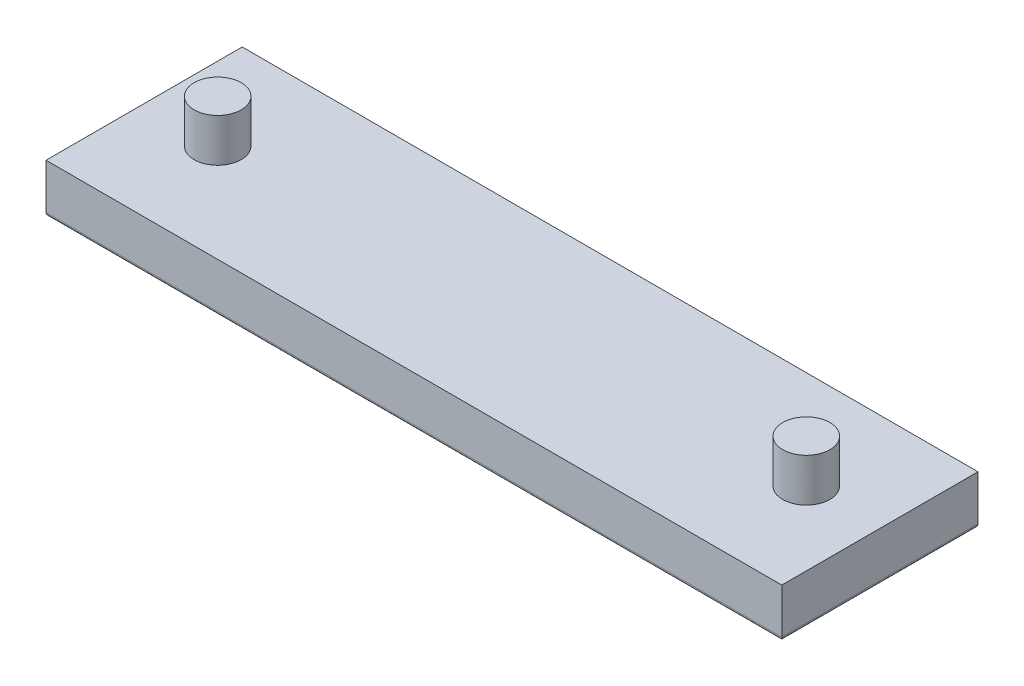
ISO-10303-21;
HEADER;
FILE_DESCRIPTION(('STEP AP214'),'2;1');
FILE_NAME('part.step','',(''),(''),'','','');
FILE_SCHEMA(('AUTOMOTIVE_DESIGN { 1 0 10303 214 1 1 1 1 }'));
ENDSEC;
DATA;
#1=APPLICATION_CONTEXT('core data for automotive mechanical design processes');
#2=APPLICATION_PROTOCOL_DEFINITION('international standard','automotive_design',2000,#1);
#3=PRODUCT_CONTEXT('',#1,'mechanical');
#4=PRODUCT('Part','Part','',(#3));
#5=PRODUCT_RELATED_PRODUCT_CATEGORY('part','',(#4));
#6=PRODUCT_DEFINITION_FORMATION('','',#4);
#7=PRODUCT_DEFINITION_CONTEXT('part definition',#1,'design');
#8=PRODUCT_DEFINITION('design','',#6,#7);
#9=PRODUCT_DEFINITION_SHAPE('','',#8);
#10=(LENGTH_UNIT() NAMED_UNIT(*) SI_UNIT(.MILLI.,.METRE.));
#11=(NAMED_UNIT(*) PLANE_ANGLE_UNIT() SI_UNIT($,.RADIAN.));
#12=(NAMED_UNIT(*) SI_UNIT($,.STERADIAN.) SOLID_ANGLE_UNIT());
#13=UNCERTAINTY_MEASURE_WITH_UNIT(LENGTH_MEASURE(1.E-05),#10,'distance_accuracy_value','');
#14=(GEOMETRIC_REPRESENTATION_CONTEXT(3) GLOBAL_UNCERTAINTY_ASSIGNED_CONTEXT((#13)) GLOBAL_UNIT_ASSIGNED_CONTEXT((#10,
#11,#12)) REPRESENTATION_CONTEXT('',''));
#15=CARTESIAN_POINT('',(0.,0.,0.));
#16=DIRECTION('',(0.,0.,1.));
#17=DIRECTION('',(1.,0.,0.));
#18=AXIS2_PLACEMENT_3D('',#15,#16,#17);
#19=CARTESIAN_POINT('',(47.625,6.35,12.7));
#20=DIRECTION('',(-1.,0.,0.));
#21=DIRECTION('',(0.,0.,1.));
#22=AXIS2_PLACEMENT_3D('',#19,#20,#21);
#23=PLANE('',#22);
#24=DIRECTION('',(0.,-1.,0.));
#25=VECTOR('',#24,1.);
#26=CARTESIAN_POINT('',(47.625,6.35,12.7));
#27=LINE('',#26,#25);
#28=CARTESIAN_POINT('',(47.625,6.35,12.7));
#29=VERTEX_POINT('',#28);
#30=CARTESIAN_POINT('',(47.625,0.508,12.7));
#31=VERTEX_POINT('',#30);
#32=EDGE_CURVE('E184',#29,#31,#27,.T.);
#33=ORIENTED_EDGE('',*,*,#32,.T.);
#34=DIRECTION('',(0.,0.,-1.));
#35=VECTOR('',#34,1.);
#36=CARTESIAN_POINT('',(47.625,0.508,-12.7));
#37=LINE('',#36,#35);
#38=CARTESIAN_POINT('',(47.625,0.508,-12.7));
#39=VERTEX_POINT('',#38);
#40=EDGE_CURVE('E11',#31,#39,#37,.T.);
#41=ORIENTED_EDGE('',*,*,#40,.T.);
#42=DIRECTION('',(0.,-1.,0.));
#43=VECTOR('',#42,1.);
#44=CARTESIAN_POINT('',(47.625,6.35,-12.7));
#45=LINE('',#44,#43);
#46=CARTESIAN_POINT('',(47.625,6.35,-12.7));
#47=VERTEX_POINT('',#46);
#48=EDGE_CURVE('E101',#47,#39,#45,.T.);
#49=ORIENTED_EDGE('',*,*,#48,.F.);
#50=DIRECTION('',(0.,0.,-1.));
#51=VECTOR('',#50,1.);
#52=CARTESIAN_POINT('',(47.625,6.35,12.7));
#53=LINE('',#52,#51);
#54=EDGE_CURVE('E108',#29,#47,#53,.T.);
#55=ORIENTED_EDGE('',*,*,#54,.F.);
#56=EDGE_LOOP('',(#33,#41,#49,#55));
#57=FACE_BOUND('',#56,.T.);
#58=ADVANCED_FACE('F39',(#57),#23,.F.);
#59=CARTESIAN_POINT('',(-47.625,6.35,-12.7));
#60=DIRECTION('',(0.,0.,1.));
#61=DIRECTION('',(1.,0.,0.));
#62=AXIS2_PLACEMENT_3D('',#59,#60,#61);
#63=PLANE('',#62);
#64=ORIENTED_EDGE('',*,*,#48,.T.);
#65=DIRECTION('',(-1.,0.,0.));
#66=VECTOR('',#65,1.);
#67=CARTESIAN_POINT('',(-47.625,0.508,-12.7));
#68=LINE('',#67,#66);
#69=CARTESIAN_POINT('',(-47.625,0.508,-12.7));
#70=VERTEX_POINT('',#69);
#71=EDGE_CURVE('E134',#39,#70,#68,.T.);
#72=ORIENTED_EDGE('',*,*,#71,.T.);
#73=DIRECTION('',(0.,-1.,0.));
#74=VECTOR('',#73,1.);
#75=CARTESIAN_POINT('',(-47.625,6.35,-12.7));
#76=LINE('',#75,#74);
#77=CARTESIAN_POINT('',(-47.625,6.35,-12.7));
#78=VERTEX_POINT('',#77);
#79=EDGE_CURVE('E103',#78,#70,#76,.T.);
#80=ORIENTED_EDGE('',*,*,#79,.F.);
#81=DIRECTION('',(-1.,0.,0.));
#82=VECTOR('',#81,1.);
#83=CARTESIAN_POINT('',(-47.625,6.35,-12.7));
#84=LINE('',#83,#82);
#85=EDGE_CURVE('E96',#47,#78,#84,.T.);
#86=ORIENTED_EDGE('',*,*,#85,.F.);
#87=EDGE_LOOP('',(#64,#72,#80,#86));
#88=FACE_BOUND('',#87,.T.);
#89=ADVANCED_FACE('F98',(#88),#63,.F.);
#90=CARTESIAN_POINT('',(-47.625,6.35,12.7));
#91=DIRECTION('',(1.,0.,0.));
#92=DIRECTION('',(0.,0.,-1.));
#93=AXIS2_PLACEMENT_3D('',#90,#91,#92);
#94=PLANE('',#93);
#95=ORIENTED_EDGE('',*,*,#79,.T.);
#96=DIRECTION('',(0.,0.,1.));
#97=VECTOR('',#96,1.);
#98=CARTESIAN_POINT('',(-47.625,0.508,12.7));
#99=LINE('',#98,#97);
#100=CARTESIAN_POINT('',(-47.625,0.508,12.7));
#101=VERTEX_POINT('',#100);
#102=EDGE_CURVE('E64',#70,#101,#99,.T.);
#103=ORIENTED_EDGE('',*,*,#102,.T.);
#104=DIRECTION('',(0.,-1.,0.));
#105=VECTOR('',#104,1.);
#106=CARTESIAN_POINT('',(-47.625,6.35,12.7));
#107=LINE('',#106,#105);
#108=CARTESIAN_POINT('',(-47.625,6.35,12.7));
#109=VERTEX_POINT('',#108);
#110=EDGE_CURVE('E127',#109,#101,#107,.T.);
#111=ORIENTED_EDGE('',*,*,#110,.F.);
#112=DIRECTION('',(0.,0.,1.));
#113=VECTOR('',#112,1.);
#114=CARTESIAN_POINT('',(-47.625,6.35,12.7));
#115=LINE('',#114,#113);
#116=EDGE_CURVE('E107',#78,#109,#115,.T.);
#117=ORIENTED_EDGE('',*,*,#116,.F.);
#118=EDGE_LOOP('',(#95,#103,#111,#117));
#119=FACE_BOUND('',#118,.T.);
#120=ADVANCED_FACE('F196',(#119),#94,.F.);
#121=CARTESIAN_POINT('',(-47.625,6.35,12.7));
#122=DIRECTION('',(0.,0.,-1.));
#123=DIRECTION('',(-1.,0.,0.));
#124=AXIS2_PLACEMENT_3D('',#121,#122,#123);
#125=PLANE('',#124);
#126=ORIENTED_EDGE('',*,*,#110,.T.);
#127=DIRECTION('',(1.,0.,0.));
#128=VECTOR('',#127,1.);
#129=CARTESIAN_POINT('',(47.625,0.508,12.7));
#130=LINE('',#129,#128);
#131=EDGE_CURVE('E49',#101,#31,#130,.T.);
#132=ORIENTED_EDGE('',*,*,#131,.T.);
#133=ORIENTED_EDGE('',*,*,#32,.F.);
#134=DIRECTION('',(1.,0.,0.));
#135=VECTOR('',#134,1.);
#136=CARTESIAN_POINT('',(-47.625,6.35,12.7));
#137=LINE('',#136,#135);
#138=EDGE_CURVE('E113',#109,#29,#137,.T.);
#139=ORIENTED_EDGE('',*,*,#138,.F.);
#140=EDGE_LOOP('',(#126,#132,#133,#139));
#141=FACE_BOUND('',#140,.T.);
#142=ADVANCED_FACE('F187',(#141),#125,.F.);
#143=CARTESIAN_POINT('',(0.,6.35,0.));
#144=DIRECTION('',(0.,-1.,0.));
#145=DIRECTION('',(0.,0.,-1.));
#146=AXIS2_PLACEMENT_3D('',#143,#144,#145);
#147=PLANE('',#146);
#148=CARTESIAN_POINT('',(-38.1,6.35,0.));
#149=DIRECTION('',(0.,-1.,0.));
#150=DIRECTION('',(0.,0.,-1.));
#151=AXIS2_PLACEMENT_3D('',#148,#149,#150);
#152=CIRCLE('',#151,3.048);
#153=CARTESIAN_POINT('',(-38.1,6.35,-3.04799999999999));
#154=VERTEX_POINT('',#153);
#155=EDGE_CURVE('E125',#154,#154,#152,.F.);
#156=ORIENTED_EDGE('',*,*,#155,.F.);
#157=EDGE_LOOP('',(#156));
#158=FACE_BOUND('',#157,.T.);
#159=CARTESIAN_POINT('',(38.1,6.35,0.));
#160=DIRECTION('',(0.,-1.,0.));
#161=DIRECTION('',(0.,0.,-1.));
#162=AXIS2_PLACEMENT_3D('',#159,#160,#161);
#163=CIRCLE('',#162,3.048);
#164=CARTESIAN_POINT('',(38.1,6.35,-3.048));
#165=VERTEX_POINT('',#164);
#166=EDGE_CURVE('E120',#165,#165,#163,.F.);
#167=ORIENTED_EDGE('',*,*,#166,.F.);
#168=EDGE_LOOP('',(#167));
#169=FACE_BOUND('',#168,.T.);
#170=ORIENTED_EDGE('',*,*,#54,.T.);
#171=ORIENTED_EDGE('',*,*,#85,.T.);
#172=ORIENTED_EDGE('',*,*,#116,.T.);
#173=ORIENTED_EDGE('',*,*,#138,.T.);
#174=EDGE_LOOP('',(#170,#171,#172,#173));
#175=FACE_BOUND('',#174,.T.);
#176=ADVANCED_FACE('F111',(#158,#169,#175),#147,.F.);
#177=CARTESIAN_POINT('',(0.,0.,0.));
#178=DIRECTION('',(0.,-1.,0.));
#179=DIRECTION('',(0.,0.,-1.));
#180=AXIS2_PLACEMENT_3D('',#177,#178,#179);
#181=PLANE('',#180);
#182=DIRECTION('',(0.,0.,1.));
#183=VECTOR('',#182,1.);
#184=CARTESIAN_POINT('',(-47.117,0.,-12.7));
#185=LINE('',#184,#183);
#186=CARTESIAN_POINT('',(-47.117,0.,12.192));
#187=VERTEX_POINT('',#186);
#188=CARTESIAN_POINT('',(-47.117,0.,-12.192));
#189=VERTEX_POINT('',#188);
#190=EDGE_CURVE('E143',#187,#189,#185,.F.);
#191=ORIENTED_EDGE('',*,*,#190,.T.);
#192=DIRECTION('',(-1.,0.,0.));
#193=VECTOR('',#192,1.);
#194=CARTESIAN_POINT('',(47.625,0.,-12.192));
#195=LINE('',#194,#193);
#196=CARTESIAN_POINT('',(47.117,0.,-12.192));
#197=VERTEX_POINT('',#196);
#198=EDGE_CURVE('E146',#189,#197,#195,.F.);
#199=ORIENTED_EDGE('',*,*,#198,.T.);
#200=DIRECTION('',(0.,0.,-1.));
#201=VECTOR('',#200,1.);
#202=CARTESIAN_POINT('',(47.117,0.,12.7));
#203=LINE('',#202,#201);
#204=CARTESIAN_POINT('',(47.117,0.,12.192));
#205=VERTEX_POINT('',#204);
#206=EDGE_CURVE('E137',#197,#205,#203,.F.);
#207=ORIENTED_EDGE('',*,*,#206,.T.);
#208=DIRECTION('',(1.,0.,0.));
#209=VECTOR('',#208,1.);
#210=CARTESIAN_POINT('',(-47.625,0.,12.192));
#211=LINE('',#210,#209);
#212=EDGE_CURVE('E140',#205,#187,#211,.F.);
#213=ORIENTED_EDGE('',*,*,#212,.T.);
#214=EDGE_LOOP('',(#191,#199,#207,#213));
#215=FACE_BOUND('',#214,.T.);
#216=ADVANCED_FACE('F237',(#215),#181,.T.);
#217=CARTESIAN_POINT('',(38.1,11.938,0.));
#218=DIRECTION('',(0.,-1.,0.));
#219=DIRECTION('',(0.,0.,-1.));
#220=AXIS2_PLACEMENT_3D('',#217,#218,#219);
#221=CYLINDRICAL_SURFACE('',#220,3.048);
#222=CARTESIAN_POINT('',(38.1,11.938,0.));
#223=DIRECTION('',(0.,1.,0.));
#224=DIRECTION('',(0.,0.,1.));
#225=AXIS2_PLACEMENT_3D('',#222,#223,#224);
#226=CIRCLE('',#225,3.048);
#227=CARTESIAN_POINT('',(38.1,11.938,3.048));
#228=VERTEX_POINT('',#227);
#229=EDGE_CURVE('E116',#228,#228,#226,.T.);
#230=ORIENTED_EDGE('',*,*,#229,.F.);
#231=EDGE_LOOP('',(#230));
#232=FACE_BOUND('',#231,.T.);
#233=ORIENTED_EDGE('',*,*,#166,.T.);
#234=EDGE_LOOP('',(#233));
#235=FACE_BOUND('',#234,.T.);
#236=ADVANCED_FACE('F233',(#232,#235),#221,.T.);
#237=CARTESIAN_POINT('',(38.1,11.938,0.));
#238=DIRECTION('',(0.,1.,0.));
#239=DIRECTION('',(0.,0.,1.));
#240=AXIS2_PLACEMENT_3D('',#237,#238,#239);
#241=PLANE('',#240);
#242=ORIENTED_EDGE('',*,*,#229,.T.);
#243=EDGE_LOOP('',(#242));
#244=FACE_BOUND('',#243,.T.);
#245=ADVANCED_FACE('F227',(#244),#241,.T.);
#246=CARTESIAN_POINT('',(-38.1,11.938,0.));
#247=DIRECTION('',(0.,-1.,0.));
#248=DIRECTION('',(0.,0.,-1.));
#249=AXIS2_PLACEMENT_3D('',#246,#247,#248);
#250=CYLINDRICAL_SURFACE('',#249,3.048);
#251=CARTESIAN_POINT('',(-38.1,11.938,0.));
#252=DIRECTION('',(0.,1.,0.));
#253=DIRECTION('',(0.,0.,-1.));
#254=AXIS2_PLACEMENT_3D('',#251,#252,#253);
#255=CIRCLE('',#254,3.048);
#256=CARTESIAN_POINT('',(-38.1,11.938,-3.04799999999999));
#257=VERTEX_POINT('',#256);
#258=EDGE_CURVE('E167',#257,#257,#255,.T.);
#259=ORIENTED_EDGE('',*,*,#258,.F.);
#260=EDGE_LOOP('',(#259));
#261=FACE_BOUND('',#260,.T.);
#262=ORIENTED_EDGE('',*,*,#155,.T.);
#263=EDGE_LOOP('',(#262));
#264=FACE_BOUND('',#263,.T.);
#265=ADVANCED_FACE('F222',(#261,#264),#250,.T.);
#266=CARTESIAN_POINT('',(-38.1,11.938,0.));
#267=DIRECTION('',(0.,-1.,0.));
#268=DIRECTION('',(0.,0.,-1.));
#269=AXIS2_PLACEMENT_3D('',#266,#267,#268);
#270=PLANE('',#269);
#271=ORIENTED_EDGE('',*,*,#258,.T.);
#272=EDGE_LOOP('',(#271));
#273=FACE_BOUND('',#272,.T.);
#274=ADVANCED_FACE('F218',(#273),#270,.F.);
#275=CARTESIAN_POINT('',(-47.625,0.508,12.192));
#276=DIRECTION('',(-1.,0.,0.));
#277=DIRECTION('',(0.,0.,1.));
#278=AXIS2_PLACEMENT_3D('',#275,#276,#277);
#279=CYLINDRICAL_SURFACE('',#278,0.508);
#280=CARTESIAN_POINT('',(-47.117,0.508,12.192));
#281=DIRECTION('',(-0.707106781186547,0.,-0.707106781186547));
#282=DIRECTION('',(-0.707106781186547,0.,0.707106781186547));
#283=AXIS2_PLACEMENT_3D('',#280,#281,#282);
#284=ELLIPSE('',#283,0.718420489685532,0.508);
#285=EDGE_CURVE('E159',#187,#101,#284,.T.);
#286=ORIENTED_EDGE('',*,*,#285,.F.);
#287=ORIENTED_EDGE('',*,*,#212,.F.);
#288=CARTESIAN_POINT('',(47.117,0.508,12.192));
#289=DIRECTION('',(-0.707106781186547,0.,0.707106781186547));
#290=DIRECTION('',(0.707106781186547,0.,0.707106781186547));
#291=AXIS2_PLACEMENT_3D('',#288,#289,#290);
#292=ELLIPSE('',#291,0.718420489685532,0.508);
#293=EDGE_CURVE('E43',#31,#205,#292,.F.);
#294=ORIENTED_EDGE('',*,*,#293,.F.);
#295=ORIENTED_EDGE('',*,*,#131,.F.);
#296=EDGE_LOOP('',(#286,#287,#294,#295));
#297=FACE_BOUND('',#296,.T.);
#298=ADVANCED_FACE('F41',(#297),#279,.T.);
#299=CARTESIAN_POINT('',(47.117,0.508,12.7));
#300=DIRECTION('',(0.,0.,1.));
#301=DIRECTION('',(1.,0.,0.));
#302=AXIS2_PLACEMENT_3D('',#299,#300,#301);
#303=CYLINDRICAL_SURFACE('',#302,0.508);
#304=ORIENTED_EDGE('',*,*,#293,.T.);
#305=ORIENTED_EDGE('',*,*,#206,.F.);
#306=CARTESIAN_POINT('',(47.117,0.508,-12.192));
#307=DIRECTION('',(0.707106781186547,0.,0.707106781186547));
#308=DIRECTION('',(-0.707106781186547,0.,0.707106781186547));
#309=AXIS2_PLACEMENT_3D('',#306,#307,#308);
#310=ELLIPSE('',#309,0.718420489685532,0.508);
#311=EDGE_CURVE('E157',#39,#197,#310,.F.);
#312=ORIENTED_EDGE('',*,*,#311,.F.);
#313=ORIENTED_EDGE('',*,*,#40,.F.);
#314=EDGE_LOOP('',(#304,#305,#312,#313));
#315=FACE_BOUND('',#314,.T.);
#316=ADVANCED_FACE('F190',(#315),#303,.T.);
#317=CARTESIAN_POINT('',(-47.117,0.508,12.7));
#318=DIRECTION('',(0.,0.,-1.));
#319=DIRECTION('',(-1.,0.,0.));
#320=AXIS2_PLACEMENT_3D('',#317,#318,#319);
#321=CYLINDRICAL_SURFACE('',#320,0.508);
#322=ORIENTED_EDGE('',*,*,#285,.T.);
#323=ORIENTED_EDGE('',*,*,#102,.F.);
#324=CARTESIAN_POINT('',(-47.117,0.508,-12.192));
#325=DIRECTION('',(0.707106781186547,0.,-0.707106781186547));
#326=DIRECTION('',(-0.707106781186547,0.,-0.707106781186547));
#327=AXIS2_PLACEMENT_3D('',#324,#325,#326);
#328=ELLIPSE('',#327,0.718420489685532,0.508);
#329=EDGE_CURVE('E154',#189,#70,#328,.T.);
#330=ORIENTED_EDGE('',*,*,#329,.F.);
#331=ORIENTED_EDGE('',*,*,#190,.F.);
#332=EDGE_LOOP('',(#322,#323,#330,#331));
#333=FACE_BOUND('',#332,.T.);
#334=ADVANCED_FACE('F212',(#333),#321,.T.);
#335=CARTESIAN_POINT('',(-47.625,0.508,-12.192));
#336=DIRECTION('',(1.,0.,0.));
#337=DIRECTION('',(0.,0.,-1.));
#338=AXIS2_PLACEMENT_3D('',#335,#336,#337);
#339=CYLINDRICAL_SURFACE('',#338,0.508);
#340=ORIENTED_EDGE('',*,*,#311,.T.);
#341=ORIENTED_EDGE('',*,*,#198,.F.);
#342=ORIENTED_EDGE('',*,*,#329,.T.);
#343=ORIENTED_EDGE('',*,*,#71,.F.);
#344=EDGE_LOOP('',(#340,#341,#342,#343));
#345=FACE_BOUND('',#344,.T.);
#346=ADVANCED_FACE('F194',(#345),#339,.T.);
#347=CLOSED_SHELL('',(#58,#89,#120,#142,#176,#216,#236,#245,#265,#274,#298,#316,#334,#346));
#348=MANIFOLD_SOLID_BREP('B2',#347);
#349=ADVANCED_BREP_SHAPE_REPRESENTATION('',(#18,#348),#14);
#350=SHAPE_DEFINITION_REPRESENTATION(#9,#349);
ENDSEC;
END-ISO-10303-21;
